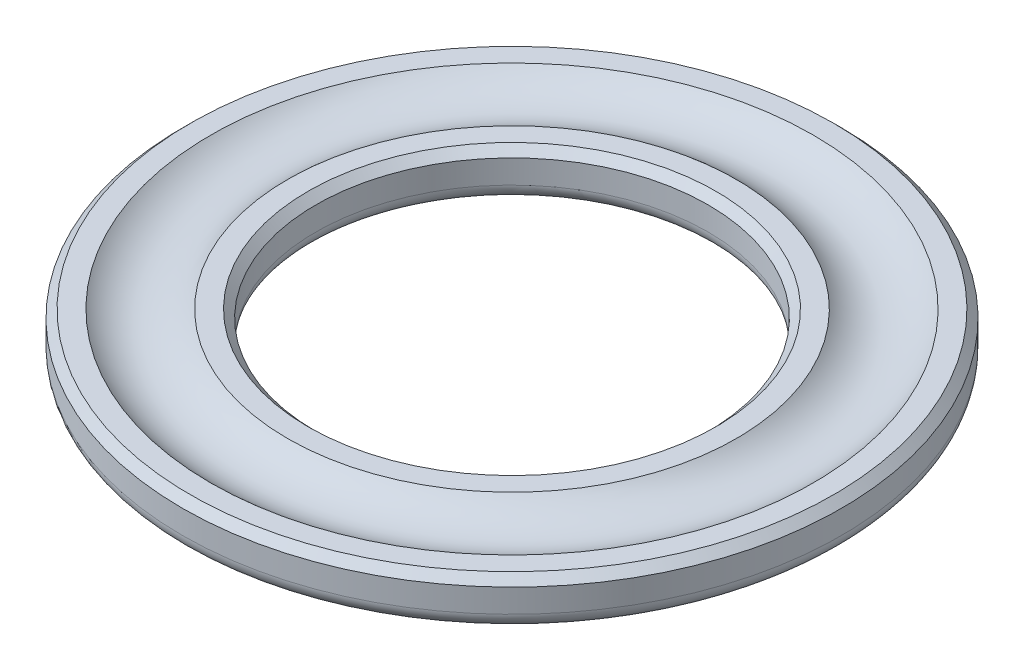
ISO-10303-21;
HEADER;
FILE_DESCRIPTION(('STEP AP214'),'2;1');
FILE_NAME('part.step','',(''),(''),'','','');
FILE_SCHEMA(('AUTOMOTIVE_DESIGN { 1 0 10303 214 1 1 1 1 }'));
ENDSEC;
DATA;
#1=APPLICATION_CONTEXT('core data for automotive mechanical design processes');
#2=APPLICATION_PROTOCOL_DEFINITION('international standard','automotive_design',2000,#1);
#3=PRODUCT_CONTEXT('',#1,'mechanical');
#4=PRODUCT('Part','Part','',(#3));
#5=PRODUCT_RELATED_PRODUCT_CATEGORY('part','',(#4));
#6=PRODUCT_DEFINITION_FORMATION('','',#4);
#7=PRODUCT_DEFINITION_CONTEXT('part definition',#1,'design');
#8=PRODUCT_DEFINITION('design','',#6,#7);
#9=PRODUCT_DEFINITION_SHAPE('','',#8);
#10=(LENGTH_UNIT() NAMED_UNIT(*) SI_UNIT(.MILLI.,.METRE.));
#11=(NAMED_UNIT(*) PLANE_ANGLE_UNIT() SI_UNIT($,.RADIAN.));
#12=(NAMED_UNIT(*) SI_UNIT($,.STERADIAN.) SOLID_ANGLE_UNIT());
#13=UNCERTAINTY_MEASURE_WITH_UNIT(LENGTH_MEASURE(1.E-05),#10,'distance_accuracy_value','');
#14=(GEOMETRIC_REPRESENTATION_CONTEXT(3) GLOBAL_UNCERTAINTY_ASSIGNED_CONTEXT((#13)) GLOBAL_UNIT_ASSIGNED_CONTEXT((#10,
#11,#12)) REPRESENTATION_CONTEXT('',''));
#15=CARTESIAN_POINT('',(0.,0.,0.));
#16=DIRECTION('',(0.,0.,1.));
#17=DIRECTION('',(1.,0.,0.));
#18=AXIS2_PLACEMENT_3D('',#15,#16,#17);
#19=CARTESIAN_POINT('',(0.,5.50000000000106,0.));
#20=DIRECTION('',(0.,0.999999999999998,0.));
#21=DIRECTION('',(0.,0.,1.));
#22=AXIS2_PLACEMENT_3D('',#19,#20,#21);
#23=CYLINDRICAL_SURFACE('',#22,12.5);
#24=CARTESIAN_POINT('',(0.,-4.5,0.));
#25=DIRECTION('',(0.,0.999999999999998,0.));
#26=DIRECTION('',(0.,0.,1.));
#27=AXIS2_PLACEMENT_3D('',#24,#25,#26);
#28=CIRCLE('',#27,12.5);
#29=CARTESIAN_POINT('',(0.,-4.5,12.5));
#30=VERTEX_POINT('',#29);
#31=EDGE_CURVE('E39',#30,#30,#28,.F.);
#32=CARTESIAN_POINT('',(0.,-2.99999999999895,-1.73472347597681E-13));
#33=DIRECTION('',(0.,-0.999999999999998,0.));
#34=DIRECTION('',(0.,0.,-1.));
#35=AXIS2_PLACEMENT_3D('',#32,#33,#34);
#36=CIRCLE('',#35,12.5);
#37=CARTESIAN_POINT('',(0.,-2.99999999999895,12.5));
#38=VERTEX_POINT('',#37);
#39=EDGE_CURVE('E61',#38,#38,#36,.F.);
#40=CARTESIAN_POINT('',(0.,-4.5,12.5));
#41=CARTESIAN_POINT('',(0.,-4.48437499999999,12.5));
#42=CARTESIAN_POINT('',(0.,-4.46874999999998,12.5));
#43=CARTESIAN_POINT('',(0.,-4.43749999999996,12.5));
#44=CARTESIAN_POINT('',(0.,-4.42187499999995,12.5));
#45=CARTESIAN_POINT('',(0.,-4.39062499999993,12.5));
#46=CARTESIAN_POINT('',(0.,-4.37499999999992,12.5));
#47=CARTESIAN_POINT('',(0.,-4.34374999999989,12.5));
#48=CARTESIAN_POINT('',(0.,-4.32812499999988,12.5));
#49=CARTESIAN_POINT('',(0.,-4.29687499999986,12.5));
#50=CARTESIAN_POINT('',(0.,-4.28124999999985,12.5));
#51=CARTESIAN_POINT('',(0.,-4.24999999999983,12.5));
#52=CARTESIAN_POINT('',(0.,-4.23437499999982,12.5));
#53=CARTESIAN_POINT('',(0.,-4.2031249999998,12.5));
#54=CARTESIAN_POINT('',(0.,-4.18749999999979,12.5));
#55=CARTESIAN_POINT('',(0.,-4.15624999999976,12.5));
#56=CARTESIAN_POINT('',(0.,-4.14062499999975,12.5));
#57=CARTESIAN_POINT('',(0.,-4.10937499999973,12.5));
#58=CARTESIAN_POINT('',(0.,-4.09374999999972,12.5));
#59=CARTESIAN_POINT('',(0.,-4.06249999999969,12.5));
#60=CARTESIAN_POINT('',(0.,-4.04687499999968,12.5));
#61=CARTESIAN_POINT('',(0.,-4.01562499999966,12.5));
#62=CARTESIAN_POINT('',(0.,-3.99999999999965,12.5));
#63=CARTESIAN_POINT('',(0.,-3.96874999999963,12.5));
#64=CARTESIAN_POINT('',(0.,-3.95312499999962,12.5));
#65=CARTESIAN_POINT('',(0.,-3.9218749999996,12.5));
#66=CARTESIAN_POINT('',(0.,-3.90624999999959,12.5));
#67=CARTESIAN_POINT('',(0.,-3.87499999999956,12.5));
#68=CARTESIAN_POINT('',(0.,-3.85937499999955,12.5));
#69=CARTESIAN_POINT('',(0.,-3.82812499999953,12.5));
#70=CARTESIAN_POINT('',(0.,-3.81249999999952,12.5));
#71=CARTESIAN_POINT('',(0.,-3.7812499999995,12.5));
#72=CARTESIAN_POINT('',(0.,-3.76562499999949,12.5));
#73=CARTESIAN_POINT('',(0.,-3.73437499999947,12.5));
#74=CARTESIAN_POINT('',(0.,-3.71874999999945,12.5));
#75=CARTESIAN_POINT('',(0.,-3.68749999999943,12.5));
#76=CARTESIAN_POINT('',(0.,-3.67187499999942,12.5));
#77=CARTESIAN_POINT('',(0.,-3.6406249999994,12.5));
#78=CARTESIAN_POINT('',(0.,-3.62499999999939,12.5));
#79=CARTESIAN_POINT('',(0.,-3.59374999999937,12.5));
#80=CARTESIAN_POINT('',(0.,-3.57812499999936,12.5));
#81=CARTESIAN_POINT('',(0.,-3.54687499999933,12.5));
#82=CARTESIAN_POINT('',(0.,-3.53124999999932,12.5));
#83=CARTESIAN_POINT('',(0.,-3.4999999999993,12.5));
#84=CARTESIAN_POINT('',(0.,-3.48437499999929,12.5));
#85=CARTESIAN_POINT('',(0.,-3.45312499999927,12.5));
#86=CARTESIAN_POINT('',(0.,-3.43749999999926,12.5));
#87=CARTESIAN_POINT('',(0.,-3.40624999999923,12.5));
#88=CARTESIAN_POINT('',(0.,-3.39062499999922,12.5));
#89=CARTESIAN_POINT('',(0.,-3.3593749999992,12.5));
#90=CARTESIAN_POINT('',(0.,-3.34374999999919,12.5));
#91=CARTESIAN_POINT('',(0.,-3.31249999999917,12.5));
#92=CARTESIAN_POINT('',(0.,-3.29687499999916,12.5));
#93=CARTESIAN_POINT('',(0.,-3.26562499999913,12.5));
#94=CARTESIAN_POINT('',(0.,-3.24999999999912,12.5));
#95=CARTESIAN_POINT('',(0.,-3.2187499999991,12.5));
#96=CARTESIAN_POINT('',(0.,-3.20312499999909,12.5));
#97=CARTESIAN_POINT('',(0.,-3.17187499999907,12.5));
#98=CARTESIAN_POINT('',(0.,-3.15624999999906,12.5));
#99=CARTESIAN_POINT('',(0.,-3.12499999999904,12.5));
#100=CARTESIAN_POINT('',(0.,-3.10937499999903,12.5));
#101=CARTESIAN_POINT('',(0.,-3.078124999999,12.5));
#102=CARTESIAN_POINT('',(0.,-3.06249999999899,12.5));
#103=CARTESIAN_POINT('',(0.,-3.03124999999897,12.5));
#104=CARTESIAN_POINT('',(0.,-3.01562499999896,12.5));
#105=CARTESIAN_POINT('',(0.,-2.99999999999895,12.5));
#106=B_SPLINE_CURVE_WITH_KNOTS('',3,(#40,#41,#42,#43,#44,#45,#46,#47,#48,#49,#50,#51,#52,#53,
#54,#55,#56,#57,#58,#59,#60,#61,#62,#63,#64,#65,#66,#67,#68,#69,#70,#71,#72,#73,#74,#75,#76,#77,
#78,#79,#80,#81,#82,#83,#84,#85,#86,#87,#88,#89,#90,#91,#92,#93,#94,#95,#96,#97,#98,#99,#100,
#101,#102,#103,#104,#105),.UNSPECIFIED.,.F.,.F.,(4,2,2,2,2,2,2,2,2,2,2,2,2,2,2,2,2,2,2,2,2,2,2,
2,2,2,2,2,2,2,2,2,4),(0.,0.046875000000033,0.093750000000066,0.140625000000099,
0.187500000000132,0.234375000000165,0.281250000000198,0.328125000000231,0.375000000000264,
0.421875000000299,0.468750000000332,0.515625000000365,0.562500000000396,0.609375000000429,
0.656250000000462,0.703125000000495,0.750000000000528,0.796875000000561,0.843750000000594,
0.890625000000627,0.93750000000066,0.984375000000693,1.03125000000073,1.07812500000076,
1.12500000000079,1.17187500000083,1.21875000000086,1.26562500000089,1.31250000000093,
1.35937500000096,1.40625000000099,1.45312500000102,1.50000000000106),.UNSPECIFIED.);
#107=EDGE_CURVE('BSEAM32',#30,#38,#106,.T.);
#108=ORIENTED_EDGE('',*,*,#31,.T.);
#109=ORIENTED_EDGE('',*,*,#39,.T.);
#110=ORIENTED_EDGE('',*,*,#107,.T.);
#111=ORIENTED_EDGE('',*,*,#107,.F.);
#112=EDGE_LOOP('',(#108,#110,#109,#111));
#113=FACE_BOUND('',#112,.T.);
#114=ADVANCED_FACE('F32',(#113),#23,.F.);
#115=CARTESIAN_POINT('',(21.,-5.50000000000001,0.));
#116=DIRECTION('',(0.,0.999999999999998,0.));
#117=DIRECTION('',(0.,0.,1.));
#118=AXIS2_PLACEMENT_3D('',#115,#116,#117);
#119=PLANE('',#118);
#120=CARTESIAN_POINT('',(0.,-5.50000000000001,0.));
#121=DIRECTION('',(0.,0.999999999999998,0.));
#122=DIRECTION('',(0.,0.,1.));
#123=AXIS2_PLACEMENT_3D('',#120,#121,#122);
#124=CIRCLE('',#123,13.5);
#125=CARTESIAN_POINT('',(0.,-5.50000000000001,13.5));
#126=VERTEX_POINT('',#125);
#127=EDGE_CURVE('E43',#126,#126,#124,.T.);
#128=ORIENTED_EDGE('',*,*,#127,.T.);
#129=EDGE_LOOP('',(#128));
#130=FACE_BOUND('',#129,.T.);
#131=CARTESIAN_POINT('',(0.,-5.50000000000001,0.));
#132=DIRECTION('',(0.,0.999999999999998,0.));
#133=DIRECTION('',(0.,0.,1.));
#134=AXIS2_PLACEMENT_3D('',#131,#132,#133);
#135=CIRCLE('',#134,20.);
#136=CARTESIAN_POINT('',(0.,-5.50000000000001,20.));
#137=VERTEX_POINT('',#136);
#138=EDGE_CURVE('E47',#137,#137,#135,.F.);
#139=ORIENTED_EDGE('',*,*,#138,.T.);
#140=EDGE_LOOP('',(#139));
#141=FACE_BOUND('',#140,.T.);
#142=ADVANCED_FACE('F87',(#130,#141),#119,.F.);
#143=CARTESIAN_POINT('',(0.,5.50000000000106,0.));
#144=DIRECTION('',(0.,0.999999999999998,0.));
#145=DIRECTION('',(0.,0.,1.));
#146=AXIS2_PLACEMENT_3D('',#143,#144,#145);
#147=CYLINDRICAL_SURFACE('',#146,21.);
#148=CARTESIAN_POINT('',(0.,-4.5,0.));
#149=DIRECTION('',(0.,0.999999999999998,0.));
#150=DIRECTION('',(0.,0.,1.));
#151=AXIS2_PLACEMENT_3D('',#148,#149,#150);
#152=CIRCLE('',#151,21.);
#153=CARTESIAN_POINT('',(0.,-4.5,21.));
#154=VERTEX_POINT('',#153);
#155=EDGE_CURVE('E10',#154,#154,#152,.T.);
#156=CARTESIAN_POINT('',(0.,-2.99999999999895,-1.73472347597681E-13));
#157=DIRECTION('',(0.,-0.999999999999998,0.));
#158=DIRECTION('',(0.,0.,-1.));
#159=AXIS2_PLACEMENT_3D('',#156,#157,#158);
#160=CIRCLE('',#159,21.);
#161=CARTESIAN_POINT('',(0.,-2.99999999999895,21.));
#162=VERTEX_POINT('',#161);
#163=EDGE_CURVE('E52',#162,#162,#160,.T.);
#164=CARTESIAN_POINT('',(0.,-4.5,21.));
#165=CARTESIAN_POINT('',(0.,-4.48437499999999,21.));
#166=CARTESIAN_POINT('',(0.,-4.46874999999998,21.));
#167=CARTESIAN_POINT('',(0.,-4.43749999999996,21.));
#168=CARTESIAN_POINT('',(0.,-4.42187499999995,21.));
#169=CARTESIAN_POINT('',(0.,-4.39062499999993,21.));
#170=CARTESIAN_POINT('',(0.,-4.37499999999991,21.));
#171=CARTESIAN_POINT('',(0.,-4.34374999999989,21.));
#172=CARTESIAN_POINT('',(0.,-4.32812499999988,21.));
#173=CARTESIAN_POINT('',(0.,-4.29687499999986,21.));
#174=CARTESIAN_POINT('',(0.,-4.28124999999985,21.));
#175=CARTESIAN_POINT('',(0.,-4.24999999999983,21.));
#176=CARTESIAN_POINT('',(0.,-4.23437499999982,21.));
#177=CARTESIAN_POINT('',(0.,-4.20312499999979,21.));
#178=CARTESIAN_POINT('',(0.,-4.18749999999978,21.));
#179=CARTESIAN_POINT('',(0.,-4.15624999999976,21.));
#180=CARTESIAN_POINT('',(0.,-4.14062499999975,21.));
#181=CARTESIAN_POINT('',(0.,-4.10937499999973,21.));
#182=CARTESIAN_POINT('',(0.,-4.09374999999971,21.));
#183=CARTESIAN_POINT('',(0.,-4.06249999999969,21.));
#184=CARTESIAN_POINT('',(0.,-4.04687499999968,21.));
#185=CARTESIAN_POINT('',(0.,-4.01562499999966,21.));
#186=CARTESIAN_POINT('',(0.,-3.99999999999965,21.));
#187=CARTESIAN_POINT('',(0.,-3.96874999999963,21.));
#188=CARTESIAN_POINT('',(0.,-3.95312499999962,21.));
#189=CARTESIAN_POINT('',(0.,-3.92187499999959,21.));
#190=CARTESIAN_POINT('',(0.,-3.90624999999958,21.));
#191=CARTESIAN_POINT('',(0.,-3.87499999999956,21.));
#192=CARTESIAN_POINT('',(0.,-3.85937499999955,21.));
#193=CARTESIAN_POINT('',(0.,-3.82812499999953,21.));
#194=CARTESIAN_POINT('',(0.,-3.81249999999952,21.));
#195=CARTESIAN_POINT('',(0.,-3.7812499999995,21.));
#196=CARTESIAN_POINT('',(0.,-3.76562499999949,21.));
#197=CARTESIAN_POINT('',(0.,-3.73437499999946,21.));
#198=CARTESIAN_POINT('',(0.,-3.71874999999945,21.));
#199=CARTESIAN_POINT('',(0.,-3.68749999999943,21.));
#200=CARTESIAN_POINT('',(0.,-3.67187499999942,21.));
#201=CARTESIAN_POINT('',(0.,-3.6406249999994,21.));
#202=CARTESIAN_POINT('',(0.,-3.62499999999939,21.));
#203=CARTESIAN_POINT('',(0.,-3.59374999999936,21.));
#204=CARTESIAN_POINT('',(0.,-3.57812499999935,21.));
#205=CARTESIAN_POINT('',(0.,-3.54687499999933,21.));
#206=CARTESIAN_POINT('',(0.,-3.53124999999932,21.));
#207=CARTESIAN_POINT('',(0.,-3.4999999999993,21.));
#208=CARTESIAN_POINT('',(0.,-3.48437499999929,21.));
#209=CARTESIAN_POINT('',(0.,-3.45312499999926,21.));
#210=CARTESIAN_POINT('',(0.,-3.43749999999925,21.));
#211=CARTESIAN_POINT('',(0.,-3.40624999999923,21.));
#212=CARTESIAN_POINT('',(0.,-3.39062499999922,21.));
#213=CARTESIAN_POINT('',(0.,-3.3593749999992,21.));
#214=CARTESIAN_POINT('',(0.,-3.34374999999919,21.));
#215=CARTESIAN_POINT('',(0.,-3.31249999999916,21.));
#216=CARTESIAN_POINT('',(0.,-3.29687499999915,21.));
#217=CARTESIAN_POINT('',(0.,-3.26562499999913,21.));
#218=CARTESIAN_POINT('',(0.,-3.24999999999912,21.));
#219=CARTESIAN_POINT('',(0.,-3.2187499999991,21.));
#220=CARTESIAN_POINT('',(0.,-3.20312499999909,21.));
#221=CARTESIAN_POINT('',(0.,-3.17187499999907,21.));
#222=CARTESIAN_POINT('',(0.,-3.15624999999905,21.));
#223=CARTESIAN_POINT('',(0.,-3.12499999999903,21.));
#224=CARTESIAN_POINT('',(0.,-3.10937499999902,21.));
#225=CARTESIAN_POINT('',(0.,-3.078124999999,21.));
#226=CARTESIAN_POINT('',(0.,-3.06249999999899,21.));
#227=CARTESIAN_POINT('',(0.,-3.03124999999897,21.));
#228=CARTESIAN_POINT('',(0.,-3.01562499999896,21.));
#229=CARTESIAN_POINT('',(0.,-2.99999999999895,21.));
#230=B_SPLINE_CURVE_WITH_KNOTS('',3,(#164,#165,#166,#167,#168,#169,#170,#171,#172,#173,#174,
#175,#176,#177,#178,#179,#180,#181,#182,#183,#184,#185,#186,#187,#188,#189,#190,#191,#192,#193,
#194,#195,#196,#197,#198,#199,#200,#201,#202,#203,#204,#205,#206,#207,#208,#209,#210,#211,#212,
#213,#214,#215,#216,#217,#218,#219,#220,#221,#222,#223,#224,#225,#226,#227,#228,#229),
.UNSPECIFIED.,.F.,.F.,(4,2,2,2,2,2,2,2,2,2,2,2,2,2,2,2,2,2,2,2,2,2,2,2,2,2,2,2,2,2,2,2,4),(0.,
0.046875000000033,0.093750000000066,0.140625000000099,0.187500000000132,0.234375000000165,
0.281250000000198,0.328125000000231,0.375000000000264,0.421875000000299,0.468750000000332,
0.515625000000365,0.562500000000396,0.609375000000429,0.656250000000462,0.703125000000495,
0.750000000000528,0.796875000000561,0.843750000000594,0.890625000000627,0.93750000000066,
0.984375000000693,1.03125000000073,1.07812500000076,1.12500000000079,1.17187500000083,
1.21875000000086,1.26562500000089,1.31250000000093,1.35937500000096,1.40625000000099,
1.45312500000102,1.50000000000106),.UNSPECIFIED.);
#231=EDGE_CURVE('BSEAM81',#154,#162,#230,.T.);
#232=ORIENTED_EDGE('',*,*,#155,.T.);
#233=ORIENTED_EDGE('',*,*,#163,.T.);
#234=ORIENTED_EDGE('',*,*,#231,.T.);
#235=ORIENTED_EDGE('',*,*,#231,.F.);
#236=EDGE_LOOP('',(#232,#234,#233,#235));
#237=FACE_BOUND('',#236,.T.);
#238=ADVANCED_FACE('F81',(#237),#147,.T.);
#239=CARTESIAN_POINT('',(19.1994897427831,-2.49999999999895,0.));
#240=DIRECTION('',(0.,-0.999999999999998,0.));
#241=DIRECTION('',(0.,0.,-1.));
#242=AXIS2_PLACEMENT_3D('',#239,#240,#241);
#243=PLANE('',#242);
#244=CARTESIAN_POINT('',(0.,-2.49999999999895,-1.31838984174237E-13));
#245=DIRECTION('',(0.,-0.999999999999998,0.));
#246=DIRECTION('',(0.,0.,-1.));
#247=AXIS2_PLACEMENT_3D('',#244,#245,#246);
#248=CIRCLE('',#247,20.5);
#249=CARTESIAN_POINT('',(0.,-2.49999999999895,-20.5000000000001));
#250=VERTEX_POINT('',#249);
#251=EDGE_CURVE('E55',#250,#250,#248,.F.);
#252=ORIENTED_EDGE('',*,*,#251,.T.);
#253=EDGE_LOOP('',(#252));
#254=FACE_BOUND('',#253,.T.);
#255=CARTESIAN_POINT('',(0.,-2.49999999999895,-1.31838984174237E-13));
#256=DIRECTION('',(0.,0.999999999999998,0.));
#257=DIRECTION('',(0.,0.,1.));
#258=AXIS2_PLACEMENT_3D('',#255,#256,#257);
#259=CIRCLE('',#258,19.1994897427832);
#260=CARTESIAN_POINT('',(0.,-2.49999999999895,19.199489742783));
#261=VERTEX_POINT('',#260);
#262=EDGE_CURVE('E64',#261,#261,#259,.T.);
#263=ORIENTED_EDGE('',*,*,#262,.F.);
#264=EDGE_LOOP('',(#263));
#265=FACE_BOUND('',#264,.T.);
#266=ADVANCED_FACE('F76',(#254,#265),#243,.F.);
#267=CARTESIAN_POINT('',(0.,0.,0.));
#268=DIRECTION('',(0.,0.999999999999998,0.));
#269=DIRECTION('',(0.,0.,1.));
#270=AXIS2_PLACEMENT_3D('',#267,#268,#269);
#271=TOROIDAL_SURFACE('',#270,16.75,3.5);
#272=CARTESIAN_POINT('',(0.,-2.49999999999895,-1.31838984174237E-13));
#273=DIRECTION('',(0.,0.999999999999998,0.));
#274=DIRECTION('',(0.,0.,1.));
#275=AXIS2_PLACEMENT_3D('',#272,#273,#274);
#276=CIRCLE('',#275,14.3005102572168);
#277=CARTESIAN_POINT('',(0.,-2.49999999999895,14.3005102572167));
#278=VERTEX_POINT('',#277);
#279=EDGE_CURVE('E67',#278,#278,#276,.T.);
#280=ORIENTED_EDGE('',*,*,#279,.F.);
#281=EDGE_LOOP('',(#280));
#282=FACE_BOUND('',#281,.T.);
#283=ORIENTED_EDGE('',*,*,#262,.T.);
#284=EDGE_LOOP('',(#283));
#285=FACE_BOUND('',#284,.T.);
#286=ADVANCED_FACE('F73',(#282,#285),#271,.F.);
#287=CARTESIAN_POINT('',(12.5,-2.49999999999895,0.));
#288=DIRECTION('',(0.,-0.999999999999998,0.));
#289=DIRECTION('',(0.,0.,-1.));
#290=AXIS2_PLACEMENT_3D('',#287,#288,#289);
#291=PLANE('',#290);
#292=CARTESIAN_POINT('',(0.,-2.49999999999895,-1.31838984174237E-13));
#293=DIRECTION('',(0.,-0.999999999999998,0.));
#294=DIRECTION('',(0.,0.,-1.));
#295=AXIS2_PLACEMENT_3D('',#292,#293,#294);
#296=CIRCLE('',#295,13.);
#297=CARTESIAN_POINT('',(0.,-2.49999999999895,12.9999999999998));
#298=VERTEX_POINT('',#297);
#299=EDGE_CURVE('E58',#298,#298,#296,.T.);
#300=ORIENTED_EDGE('',*,*,#299,.T.);
#301=EDGE_LOOP('',(#300));
#302=FACE_BOUND('',#301,.T.);
#303=ORIENTED_EDGE('',*,*,#279,.T.);
#304=EDGE_LOOP('',(#303));
#305=FACE_BOUND('',#304,.T.);
#306=ADVANCED_FACE('F71',(#302,#305),#291,.F.);
#307=CARTESIAN_POINT('',(0.,-2.99999999999895,-1.73472347597681E-13));
#308=DIRECTION('',(0.,0.999999999999998,0.));
#309=DIRECTION('',(0.,0.,1.));
#310=AXIS2_PLACEMENT_3D('',#307,#308,#309);
#311=CONICAL_SURFACE('',#310,12.5,0.785398163397452);
#312=CARTESIAN_POINT('',(0.,-2.49999999999895,12.9999999999998));
#313=CARTESIAN_POINT('',(0.,-2.50520833333228,12.9947916666665));
#314=CARTESIAN_POINT('',(0.,-2.51041666666561,12.9895833333332));
#315=CARTESIAN_POINT('',(0.,-2.52083333333228,12.9791666666665));
#316=CARTESIAN_POINT('',(0.,-2.52604166666561,12.9739583333332));
#317=CARTESIAN_POINT('',(0.,-2.53645833333228,12.9635416666665));
#318=CARTESIAN_POINT('',(0.,-2.54166666666561,12.9583333333332));
#319=CARTESIAN_POINT('',(0.,-2.55208333333228,12.9479166666665));
#320=CARTESIAN_POINT('',(0.,-2.55729166666561,12.9427083333332));
#321=CARTESIAN_POINT('',(0.,-2.56770833333228,12.9322916666665));
#322=CARTESIAN_POINT('',(0.,-2.57291666666561,12.9270833333332));
#323=CARTESIAN_POINT('',(0.,-2.58333333333228,12.9166666666665));
#324=CARTESIAN_POINT('',(0.,-2.58854166666561,12.9114583333332));
#325=CARTESIAN_POINT('',(0.,-2.59895833333228,12.9010416666665));
#326=CARTESIAN_POINT('',(0.,-2.60416666666561,12.8958333333332));
#327=CARTESIAN_POINT('',(0.,-2.61458333333228,12.8854166666665));
#328=CARTESIAN_POINT('',(0.,-2.61979166666561,12.8802083333332));
#329=CARTESIAN_POINT('',(0.,-2.63020833333228,12.8697916666665));
#330=CARTESIAN_POINT('',(0.,-2.63541666666561,12.8645833333332));
#331=CARTESIAN_POINT('',(0.,-2.64583333333228,12.8541666666665));
#332=CARTESIAN_POINT('',(0.,-2.65104166666561,12.8489583333332));
#333=CARTESIAN_POINT('',(0.,-2.66145833333228,12.8385416666665));
#334=CARTESIAN_POINT('',(0.,-2.66666666666561,12.8333333333332));
#335=CARTESIAN_POINT('',(0.,-2.67708333333228,12.8229166666665));
#336=CARTESIAN_POINT('',(0.,-2.68229166666561,12.8177083333332));
#337=CARTESIAN_POINT('',(0.,-2.69270833333228,12.8072916666665));
#338=CARTESIAN_POINT('',(0.,-2.69791666666561,12.8020833333332));
#339=CARTESIAN_POINT('',(0.,-2.70833333333228,12.7916666666665));
#340=CARTESIAN_POINT('',(0.,-2.71354166666561,12.7864583333332));
#341=CARTESIAN_POINT('',(0.,-2.72395833333228,12.7760416666665));
#342=CARTESIAN_POINT('',(0.,-2.72916666666561,12.7708333333332));
#343=CARTESIAN_POINT('',(0.,-2.73958333333228,12.7604166666665));
#344=CARTESIAN_POINT('',(0.,-2.74479166666561,12.7552083333332));
#345=CARTESIAN_POINT('',(0.,-2.75520833333228,12.7447916666665));
#346=CARTESIAN_POINT('',(0.,-2.76041666666561,12.7395833333332));
#347=CARTESIAN_POINT('',(0.,-2.77083333333228,12.7291666666665));
#348=CARTESIAN_POINT('',(0.,-2.77604166666561,12.7239583333332));
#349=CARTESIAN_POINT('',(0.,-2.78645833333228,12.7135416666665));
#350=CARTESIAN_POINT('',(0.,-2.79166666666561,12.7083333333332));
#351=CARTESIAN_POINT('',(0.,-2.80208333333228,12.6979166666665));
#352=CARTESIAN_POINT('',(0.,-2.80729166666561,12.6927083333332));
#353=CARTESIAN_POINT('',(0.,-2.81770833333228,12.6822916666665));
#354=CARTESIAN_POINT('',(0.,-2.82291666666561,12.6770833333332));
#355=CARTESIAN_POINT('',(0.,-2.83333333333228,12.6666666666665));
#356=CARTESIAN_POINT('',(0.,-2.83854166666561,12.6614583333332));
#357=CARTESIAN_POINT('',(0.,-2.84895833333228,12.6510416666665));
#358=CARTESIAN_POINT('',(0.,-2.85416666666561,12.6458333333332));
#359=CARTESIAN_POINT('',(0.,-2.86458333333228,12.6354166666665));
#360=CARTESIAN_POINT('',(0.,-2.86979166666561,12.6302083333332));
#361=CARTESIAN_POINT('',(0.,-2.88020833333228,12.6197916666665));
#362=CARTESIAN_POINT('',(0.,-2.88541666666561,12.6145833333332));
#363=CARTESIAN_POINT('',(0.,-2.89583333333228,12.6041666666665));
#364=CARTESIAN_POINT('',(0.,-2.90104166666561,12.5989583333332));
#365=CARTESIAN_POINT('',(0.,-2.91145833333228,12.5885416666665));
#366=CARTESIAN_POINT('',(0.,-2.91666666666561,12.5833333333332));
#367=CARTESIAN_POINT('',(0.,-2.92708333333228,12.5729166666665));
#368=CARTESIAN_POINT('',(0.,-2.93229166666561,12.5677083333332));
#369=CARTESIAN_POINT('',(0.,-2.94270833333228,12.5572916666665));
#370=CARTESIAN_POINT('',(0.,-2.94791666666561,12.5520833333332));
#371=CARTESIAN_POINT('',(0.,-2.95833333333228,12.5416666666665));
#372=CARTESIAN_POINT('',(0.,-2.96354166666561,12.5364583333332));
#373=CARTESIAN_POINT('',(0.,-2.97395833333228,12.5260416666665));
#374=CARTESIAN_POINT('',(0.,-2.97916666666561,12.5208333333332));
#375=CARTESIAN_POINT('',(0.,-2.98958333333228,12.5104166666665));
#376=CARTESIAN_POINT('',(0.,-2.99479166666561,12.5052083333332));
#377=CARTESIAN_POINT('',(0.,-2.99999999999895,12.4999999999998));
#378=B_SPLINE_CURVE_WITH_KNOTS('',3,(#312,#313,#314,#315,#316,#317,#318,#319,#320,#321,#322,
#323,#324,#325,#326,#327,#328,#329,#330,#331,#332,#333,#334,#335,#336,#337,#338,#339,#340,#341,
#342,#343,#344,#345,#346,#347,#348,#349,#350,#351,#352,#353,#354,#355,#356,#357,#358,#359,#360,
#361,#362,#363,#364,#365,#366,#367,#368,#369,#370,#371,#372,#373,#374,#375,#376,#377),
.UNSPECIFIED.,.F.,.F.,(4,2,2,2,2,2,2,2,2,2,2,2,2,2,2,2,2,2,2,2,2,2,2,2,2,2,2,2,2,2,2,2,4),(0.,
0.0220970869120796,0.044194173824159,0.0662912607362389,0.0883883476483182,0.110485434560398,
0.132582521472478,0.154679608384557,0.176776695296637,0.198873782208718,0.220970869120797,
0.243067956032877,0.265165042944957,0.287262129857036,0.309359216769116,0.331456303681196,
0.353553390593275,0.375650477505355,0.397747564417434,0.419844651329514,0.441941738241594,
0.464038825153673,0.486135912065754,0.508232998977834,0.530330085889914,0.552427172801993,
0.574524259714073,0.596621346626153,0.618718433538232,0.640815520450312,0.662912607362391,
0.685009694274471,0.707106781186551),.UNSPECIFIED.);
#379=EDGE_CURVE('BSEAM98',#298,#38,#378,.T.);
#380=ORIENTED_EDGE('',*,*,#299,.F.);
#381=ORIENTED_EDGE('',*,*,#39,.F.);
#382=ORIENTED_EDGE('',*,*,#379,.T.);
#383=ORIENTED_EDGE('',*,*,#379,.F.);
#384=EDGE_LOOP('',(#380,#382,#381,#383));
#385=FACE_BOUND('',#384,.T.);
#386=ADVANCED_FACE('F98',(#385),#311,.F.);
#387=CARTESIAN_POINT('',(0.,-2.49999999999895,-1.31838984174237E-13));
#388=DIRECTION('',(0.,-0.999999999999998,0.));
#389=DIRECTION('',(0.,0.,-1.));
#390=AXIS2_PLACEMENT_3D('',#387,#388,#389);
#391=CONICAL_SURFACE('',#390,20.5,0.785398163397445);
#392=ORIENTED_EDGE('',*,*,#163,.F.);
#393=EDGE_LOOP('',(#392));
#394=FACE_BOUND('',#393,.T.);
#395=ORIENTED_EDGE('',*,*,#251,.F.);
#396=EDGE_LOOP('',(#395));
#397=FACE_BOUND('',#396,.T.);
#398=ADVANCED_FACE('F101',(#394,#397),#391,.T.);
#399=CARTESIAN_POINT('',(0.,-4.5,0.));
#400=DIRECTION('',(0.,0.999999999999998,0.));
#401=DIRECTION('',(0.,0.,1.));
#402=AXIS2_PLACEMENT_3D('',#399,#400,#401);
#403=TOROIDAL_SURFACE('',#402,13.5,1.);
#404=ORIENTED_EDGE('',*,*,#31,.F.);
#405=EDGE_LOOP('',(#404));
#406=FACE_BOUND('',#405,.T.);
#407=ORIENTED_EDGE('',*,*,#127,.F.);
#408=EDGE_LOOP('',(#407));
#409=FACE_BOUND('',#408,.T.);
#410=ADVANCED_FACE('F104',(#406,#409),#403,.T.);
#411=CARTESIAN_POINT('',(0.,-4.5,0.));
#412=DIRECTION('',(0.,0.999999999999998,0.));
#413=DIRECTION('',(0.,0.,1.));
#414=AXIS2_PLACEMENT_3D('',#411,#412,#413);
#415=TOROIDAL_SURFACE('',#414,20.,1.);
#416=ORIENTED_EDGE('',*,*,#138,.F.);
#417=EDGE_LOOP('',(#416));
#418=FACE_BOUND('',#417,.T.);
#419=ORIENTED_EDGE('',*,*,#155,.F.);
#420=EDGE_LOOP('',(#419));
#421=FACE_BOUND('',#420,.T.);
#422=ADVANCED_FACE('F34',(#418,#421),#415,.T.);
#423=CLOSED_SHELL('',(#114,#142,#238,#266,#286,#306,#386,#398,#410,#422));
#424=MANIFOLD_SOLID_BREP('B2',#423);
#425=ADVANCED_BREP_SHAPE_REPRESENTATION('',(#18,#424),#14);
#426=SHAPE_DEFINITION_REPRESENTATION(#9,#425);
ENDSEC;
END-ISO-10303-21;
